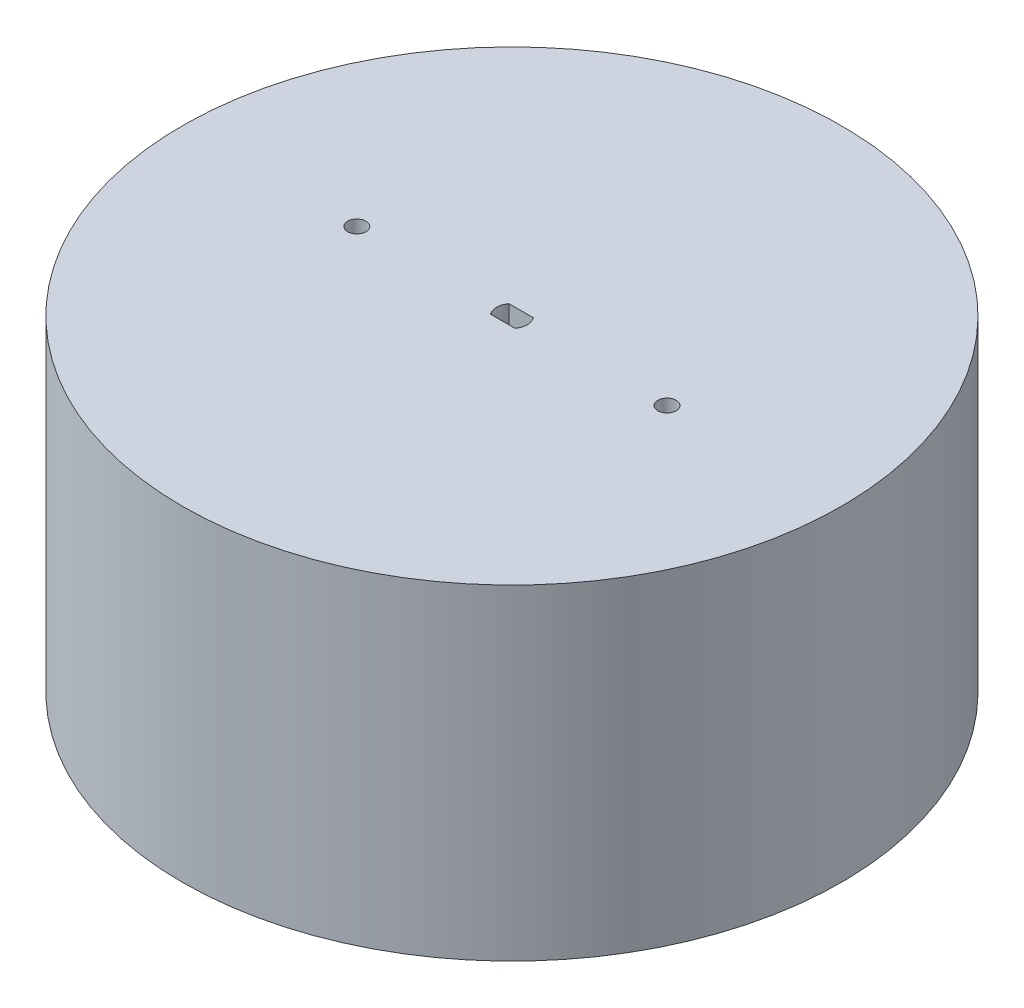
ISO-10303-21;
HEADER;
FILE_DESCRIPTION(('STEP AP214'),'2;1');
FILE_NAME('part.step','',(''),(''),'','','');
FILE_SCHEMA(('AUTOMOTIVE_DESIGN { 1 0 10303 214 1 1 1 1 }'));
ENDSEC;
DATA;
#1=APPLICATION_CONTEXT('core data for automotive mechanical design processes');
#2=APPLICATION_PROTOCOL_DEFINITION('international standard','automotive_design',2000,#1);
#3=PRODUCT_CONTEXT('',#1,'mechanical');
#4=PRODUCT('Part','Part','',(#3));
#5=PRODUCT_RELATED_PRODUCT_CATEGORY('part','',(#4));
#6=PRODUCT_DEFINITION_FORMATION('','',#4);
#7=PRODUCT_DEFINITION_CONTEXT('part definition',#1,'design');
#8=PRODUCT_DEFINITION('design','',#6,#7);
#9=PRODUCT_DEFINITION_SHAPE('','',#8);
#10=(LENGTH_UNIT() NAMED_UNIT(*) SI_UNIT(.MILLI.,.METRE.));
#11=(NAMED_UNIT(*) PLANE_ANGLE_UNIT() SI_UNIT($,.RADIAN.));
#12=(NAMED_UNIT(*) SI_UNIT($,.STERADIAN.) SOLID_ANGLE_UNIT());
#13=UNCERTAINTY_MEASURE_WITH_UNIT(LENGTH_MEASURE(1.E-05),#10,'distance_accuracy_value','');
#14=(GEOMETRIC_REPRESENTATION_CONTEXT(3) GLOBAL_UNCERTAINTY_ASSIGNED_CONTEXT((#13)) GLOBAL_UNIT_ASSIGNED_CONTEXT((#10,
#11,#12)) REPRESENTATION_CONTEXT('',''));
#15=CARTESIAN_POINT('',(0.,0.,0.));
#16=DIRECTION('',(0.,0.,1.));
#17=DIRECTION('',(1.,0.,0.));
#18=AXIS2_PLACEMENT_3D('',#15,#16,#17);
#19=CARTESIAN_POINT('',(0.,0.,0.));
#20=DIRECTION('',(0.,1.,0.));
#21=DIRECTION('',(0.,0.,1.));
#22=AXIS2_PLACEMENT_3D('',#19,#20,#21);
#23=PLANE('',#22);
#24=CARTESIAN_POINT('',(25.4,0.,0.));
#25=DIRECTION('',(0.,1.,0.));
#26=DIRECTION('',(0.,0.,1.));
#27=AXIS2_PLACEMENT_3D('',#24,#25,#26);
#28=CIRCLE('',#27,1.5);
#29=CARTESIAN_POINT('',(25.4,0.,1.5));
#30=VERTEX_POINT('',#29);
#31=EDGE_CURVE('E288',#30,#30,#28,.T.);
#32=ORIENTED_EDGE('',*,*,#31,.T.);
#33=EDGE_LOOP('',(#32));
#34=FACE_BOUND('',#33,.T.);
#35=CARTESIAN_POINT('',(-25.4,0.,0.));
#36=DIRECTION('',(0.,1.,0.));
#37=DIRECTION('',(0.,0.,1.));
#38=AXIS2_PLACEMENT_3D('',#35,#36,#37);
#39=CIRCLE('',#38,1.5);
#40=CARTESIAN_POINT('',(-25.4,0.,1.5));
#41=VERTEX_POINT('',#40);
#42=EDGE_CURVE('E294',#41,#41,#39,.T.);
#43=ORIENTED_EDGE('',*,*,#42,.T.);
#44=EDGE_LOOP('',(#43));
#45=FACE_BOUND('',#44,.T.);
#46=DIRECTION('',(-1.,0.,0.));
#47=VECTOR('',#46,1.);
#48=CARTESIAN_POINT('',(0.,0.,-1.5));
#49=LINE('',#48,#47);
#50=CARTESIAN_POINT('',(2.00000000000027,0.,-1.5));
#51=VERTEX_POINT('',#50);
#52=CARTESIAN_POINT('',(-1.99999999999974,0.,-1.5));
#53=VERTEX_POINT('',#52);
#54=EDGE_CURVE('E56',#51,#53,#49,.T.);
#55=ORIENTED_EDGE('',*,*,#54,.T.);
#56=CARTESIAN_POINT('',(4.70977423727703E-13,0.,0.));
#57=DIRECTION('',(0.,1.,0.));
#58=DIRECTION('',(0.,0.,1.));
#59=AXIS2_PLACEMENT_3D('',#56,#57,#58);
#60=CIRCLE('',#59,2.50000000000017);
#61=CARTESIAN_POINT('',(-1.99999999999974,0.,1.5));
#62=VERTEX_POINT('',#61);
#63=EDGE_CURVE('E11',#53,#62,#60,.T.);
#64=ORIENTED_EDGE('',*,*,#63,.T.);
#65=DIRECTION('',(1.,0.,0.));
#66=VECTOR('',#65,1.);
#67=CARTESIAN_POINT('',(0.,0.,1.5));
#68=LINE('',#67,#66);
#69=CARTESIAN_POINT('',(2.00000000000027,0.,1.5));
#70=VERTEX_POINT('',#69);
#71=EDGE_CURVE('E136',#62,#70,#68,.T.);
#72=ORIENTED_EDGE('',*,*,#71,.T.);
#73=CARTESIAN_POINT('',(0.,0.,0.));
#74=DIRECTION('',(0.,1.,0.));
#75=DIRECTION('',(0.,0.,1.));
#76=AXIS2_PLACEMENT_3D('',#73,#74,#75);
#77=CIRCLE('',#76,2.50000000000021);
#78=EDGE_CURVE('E95',#70,#51,#77,.T.);
#79=ORIENTED_EDGE('',*,*,#78,.T.);
#80=EDGE_LOOP('',(#55,#64,#72,#79));
#81=FACE_BOUND('',#80,.T.);
#82=CARTESIAN_POINT('',(0.,0.,0.));
#83=DIRECTION('',(0.,-1.,0.));
#84=DIRECTION('',(0.,0.,-1.));
#85=AXIS2_PLACEMENT_3D('',#82,#83,#84);
#86=CIRCLE('',#85,34.925);
#87=CARTESIAN_POINT('',(0.,0.,-34.925));
#88=VERTEX_POINT('',#87);
#89=EDGE_CURVE('E282',#88,#88,#86,.T.);
#90=ORIENTED_EDGE('',*,*,#89,.T.);
#91=EDGE_LOOP('',(#90));
#92=FACE_BOUND('',#91,.T.);
#93=ADVANCED_FACE('F47',(#34,#45,#81,#92),#23,.F.);
#94=CARTESIAN_POINT('',(0.,8.89,0.));
#95=DIRECTION('',(0.,-1.,0.));
#96=DIRECTION('',(0.,0.,-1.));
#97=AXIS2_PLACEMENT_3D('',#94,#95,#96);
#98=CYLINDRICAL_SURFACE('',#97,53.975);
#99=CARTESIAN_POINT('',(0.,8.89,0.));
#100=DIRECTION('',(0.,1.,0.));
#101=DIRECTION('',(0.,0.,1.));
#102=AXIS2_PLACEMENT_3D('',#99,#100,#101);
#103=CIRCLE('',#102,53.975);
#104=CARTESIAN_POINT('',(0.,8.89,53.975));
#105=VERTEX_POINT('',#104);
#106=EDGE_CURVE('E132',#105,#105,#103,.T.);
#107=ORIENTED_EDGE('',*,*,#106,.F.);
#108=EDGE_LOOP('',(#107));
#109=FACE_BOUND('',#108,.T.);
#110=CARTESIAN_POINT('',(0.,-44.45,0.));
#111=DIRECTION('',(0.,1.,0.));
#112=DIRECTION('',(0.,0.,1.));
#113=AXIS2_PLACEMENT_3D('',#110,#111,#112);
#114=CIRCLE('',#113,53.975);
#115=CARTESIAN_POINT('',(0.,-44.45,53.975));
#116=VERTEX_POINT('',#115);
#117=EDGE_CURVE('E128',#116,#116,#114,.T.);
#118=ORIENTED_EDGE('',*,*,#117,.T.);
#119=EDGE_LOOP('',(#118));
#120=FACE_BOUND('',#119,.T.);
#121=ADVANCED_FACE('F49',(#109,#120),#98,.T.);
#122=CARTESIAN_POINT('',(0.,8.89,0.));
#123=DIRECTION('',(0.,1.,0.));
#124=DIRECTION('',(0.,0.,1.));
#125=AXIS2_PLACEMENT_3D('',#122,#123,#124);
#126=PLANE('',#125);
#127=CARTESIAN_POINT('',(25.4,8.89,0.));
#128=DIRECTION('',(0.,1.,0.));
#129=DIRECTION('',(0.,0.,1.));
#130=AXIS2_PLACEMENT_3D('',#127,#128,#129);
#131=CIRCLE('',#130,1.5);
#132=CARTESIAN_POINT('',(25.4,8.89,1.5));
#133=VERTEX_POINT('',#132);
#134=EDGE_CURVE('E298',#133,#133,#131,.T.);
#135=ORIENTED_EDGE('',*,*,#134,.F.);
#136=EDGE_LOOP('',(#135));
#137=FACE_BOUND('',#136,.T.);
#138=CARTESIAN_POINT('',(-25.4,8.89,0.));
#139=DIRECTION('',(0.,1.,0.));
#140=DIRECTION('',(0.,0.,1.));
#141=AXIS2_PLACEMENT_3D('',#138,#139,#140);
#142=CIRCLE('',#141,1.5);
#143=CARTESIAN_POINT('',(-25.4,8.89,1.5));
#144=VERTEX_POINT('',#143);
#145=EDGE_CURVE('E299',#144,#144,#142,.T.);
#146=ORIENTED_EDGE('',*,*,#145,.F.);
#147=EDGE_LOOP('',(#146));
#148=FACE_BOUND('',#147,.T.);
#149=CARTESIAN_POINT('',(4.70977423727703E-13,8.89,0.));
#150=DIRECTION('',(0.,1.,0.));
#151=DIRECTION('',(0.,0.,1.));
#152=AXIS2_PLACEMENT_3D('',#149,#150,#151);
#153=CIRCLE('',#152,2.50000000000017);
#154=CARTESIAN_POINT('',(-1.99999999999974,8.89,-1.5));
#155=VERTEX_POINT('',#154);
#156=CARTESIAN_POINT('',(-1.99999999999974,8.89,1.5));
#157=VERTEX_POINT('',#156);
#158=EDGE_CURVE('E63',#155,#157,#153,.T.);
#159=ORIENTED_EDGE('',*,*,#158,.F.);
#160=DIRECTION('',(-1.,0.,0.));
#161=VECTOR('',#160,1.);
#162=CARTESIAN_POINT('',(-1.99999999999974,8.89,-1.5));
#163=LINE('',#162,#161);
#164=CARTESIAN_POINT('',(2.00000000000027,8.89,-1.5));
#165=VERTEX_POINT('',#164);
#166=EDGE_CURVE('E110',#165,#155,#163,.T.);
#167=ORIENTED_EDGE('',*,*,#166,.F.);
#168=CARTESIAN_POINT('',(0.,8.89,0.));
#169=DIRECTION('',(0.,1.,0.));
#170=DIRECTION('',(0.,0.,-1.));
#171=AXIS2_PLACEMENT_3D('',#168,#169,#170);
#172=CIRCLE('',#171,2.50000000000021);
#173=CARTESIAN_POINT('',(2.00000000000027,8.89,1.5));
#174=VERTEX_POINT('',#173);
#175=EDGE_CURVE('E92',#174,#165,#172,.T.);
#176=ORIENTED_EDGE('',*,*,#175,.F.);
#177=DIRECTION('',(1.,0.,0.));
#178=VECTOR('',#177,1.);
#179=CARTESIAN_POINT('',(-1.99999999999974,8.89,1.5));
#180=LINE('',#179,#178);
#181=EDGE_CURVE('E102',#157,#174,#180,.T.);
#182=ORIENTED_EDGE('',*,*,#181,.F.);
#183=EDGE_LOOP('',(#159,#167,#176,#182));
#184=FACE_BOUND('',#183,.T.);
#185=ORIENTED_EDGE('',*,*,#106,.T.);
#186=EDGE_LOOP('',(#185));
#187=FACE_BOUND('',#186,.T.);
#188=ADVANCED_FACE('F107',(#137,#148,#184,#187),#126,.T.);
#189=CARTESIAN_POINT('',(0.,-44.45,0.));
#190=DIRECTION('',(0.,1.,0.));
#191=DIRECTION('',(0.,0.,1.));
#192=AXIS2_PLACEMENT_3D('',#189,#190,#191);
#193=PLANE('',#192);
#194=CARTESIAN_POINT('',(0.,-44.45,0.));
#195=DIRECTION('',(0.,1.,0.));
#196=DIRECTION('',(0.,0.,1.));
#197=AXIS2_PLACEMENT_3D('',#194,#195,#196);
#198=CIRCLE('',#197,47.625);
#199=CARTESIAN_POINT('',(0.,-44.45,47.625));
#200=VERTEX_POINT('',#199);
#201=EDGE_CURVE('E120',#200,#200,#198,.T.);
#202=ORIENTED_EDGE('',*,*,#201,.T.);
#203=EDGE_LOOP('',(#202));
#204=FACE_BOUND('',#203,.T.);
#205=ORIENTED_EDGE('',*,*,#117,.F.);
#206=EDGE_LOOP('',(#205));
#207=FACE_BOUND('',#206,.T.);
#208=ADVANCED_FACE('F157',(#204,#207),#193,.F.);
#209=CARTESIAN_POINT('',(0.,-44.45,0.));
#210=DIRECTION('',(0.,1.,0.));
#211=DIRECTION('',(0.,0.,1.));
#212=AXIS2_PLACEMENT_3D('',#209,#210,#211);
#213=CYLINDRICAL_SURFACE('',#212,47.625);
#214=CARTESIAN_POINT('',(0.,-3.4925,0.));
#215=DIRECTION('',(0.,-1.,0.));
#216=DIRECTION('',(0.,0.,-1.));
#217=AXIS2_PLACEMENT_3D('',#214,#215,#216);
#218=CIRCLE('',#217,47.625);
#219=CARTESIAN_POINT('',(0.,-3.4925,-47.625));
#220=VERTEX_POINT('',#219);
#221=EDGE_CURVE('E277',#220,#220,#218,.T.);
#222=ORIENTED_EDGE('',*,*,#221,.F.);
#223=EDGE_LOOP('',(#222));
#224=FACE_BOUND('',#223,.T.);
#225=ORIENTED_EDGE('',*,*,#201,.F.);
#226=EDGE_LOOP('',(#225));
#227=FACE_BOUND('',#226,.T.);
#228=ADVANCED_FACE('F149',(#224,#227),#213,.F.);
#229=CARTESIAN_POINT('',(4.70977423727703E-13,-16.51,0.));
#230=DIRECTION('',(0.,1.,0.));
#231=DIRECTION('',(0.,0.,1.));
#232=AXIS2_PLACEMENT_3D('',#229,#230,#231);
#233=CYLINDRICAL_SURFACE('',#232,2.50000000000017);
#234=DIRECTION('',(0.,1.,0.));
#235=VECTOR('',#234,1.);
#236=CARTESIAN_POINT('',(-1.99999999999974,-16.51,-1.5));
#237=LINE('',#236,#235);
#238=EDGE_CURVE('E117',#53,#155,#237,.T.);
#239=ORIENTED_EDGE('',*,*,#238,.T.);
#240=ORIENTED_EDGE('',*,*,#158,.T.);
#241=DIRECTION('',(0.,1.,0.));
#242=VECTOR('',#241,1.);
#243=CARTESIAN_POINT('',(-1.99999999999974,-16.51,1.5));
#244=LINE('',#243,#242);
#245=EDGE_CURVE('E99',#62,#157,#244,.T.);
#246=ORIENTED_EDGE('',*,*,#245,.F.);
#247=ORIENTED_EDGE('',*,*,#63,.F.);
#248=EDGE_LOOP('',(#239,#240,#246,#247));
#249=FACE_BOUND('',#248,.T.);
#250=ADVANCED_FACE('F147',(#249),#233,.F.);
#251=CARTESIAN_POINT('',(-1.99999999999974,-16.51,-1.5));
#252=DIRECTION('',(0.,0.,-1.));
#253=DIRECTION('',(-1.,0.,0.));
#254=AXIS2_PLACEMENT_3D('',#251,#252,#253);
#255=PLANE('',#254);
#256=DIRECTION('',(0.,1.,0.));
#257=VECTOR('',#256,1.);
#258=CARTESIAN_POINT('',(2.00000000000027,-16.51,-1.5));
#259=LINE('',#258,#257);
#260=EDGE_CURVE('E98',#51,#165,#259,.T.);
#261=ORIENTED_EDGE('',*,*,#260,.T.);
#262=ORIENTED_EDGE('',*,*,#166,.T.);
#263=ORIENTED_EDGE('',*,*,#238,.F.);
#264=ORIENTED_EDGE('',*,*,#54,.F.);
#265=EDGE_LOOP('',(#261,#262,#263,#264));
#266=FACE_BOUND('',#265,.T.);
#267=ADVANCED_FACE('F146',(#266),#255,.F.);
#268=CARTESIAN_POINT('',(0.,-16.51,0.));
#269=DIRECTION('',(0.,1.,0.));
#270=DIRECTION('',(0.,0.,1.));
#271=AXIS2_PLACEMENT_3D('',#268,#269,#270);
#272=CYLINDRICAL_SURFACE('',#271,2.50000000000021);
#273=DIRECTION('',(0.,1.,0.));
#274=VECTOR('',#273,1.);
#275=CARTESIAN_POINT('',(2.00000000000027,-16.51,1.5));
#276=LINE('',#275,#274);
#277=EDGE_CURVE('E71',#70,#174,#276,.T.);
#278=ORIENTED_EDGE('',*,*,#277,.T.);
#279=ORIENTED_EDGE('',*,*,#175,.T.);
#280=ORIENTED_EDGE('',*,*,#260,.F.);
#281=ORIENTED_EDGE('',*,*,#78,.F.);
#282=EDGE_LOOP('',(#278,#279,#280,#281));
#283=FACE_BOUND('',#282,.T.);
#284=ADVANCED_FACE('F89',(#283),#272,.F.);
#285=CARTESIAN_POINT('',(-1.99999999999974,-16.51,1.5));
#286=DIRECTION('',(0.,0.,1.));
#287=DIRECTION('',(1.,0.,0.));
#288=AXIS2_PLACEMENT_3D('',#285,#286,#287);
#289=PLANE('',#288);
#290=ORIENTED_EDGE('',*,*,#245,.T.);
#291=ORIENTED_EDGE('',*,*,#181,.T.);
#292=ORIENTED_EDGE('',*,*,#277,.F.);
#293=ORIENTED_EDGE('',*,*,#71,.F.);
#294=EDGE_LOOP('',(#290,#291,#292,#293));
#295=FACE_BOUND('',#294,.T.);
#296=ADVANCED_FACE('F103',(#295),#289,.F.);
#297=CARTESIAN_POINT('',(0.,-3.4925,0.));
#298=DIRECTION('',(0.,-1.,0.));
#299=DIRECTION('',(0.,0.,-1.));
#300=AXIS2_PLACEMENT_3D('',#297,#298,#299);
#301=PLANE('',#300);
#302=ORIENTED_EDGE('',*,*,#221,.T.);
#303=EDGE_LOOP('',(#302));
#304=FACE_BOUND('',#303,.T.);
#305=CARTESIAN_POINT('',(0.,-3.4925,0.));
#306=DIRECTION('',(0.,-1.,0.));
#307=DIRECTION('',(0.,0.,-1.));
#308=AXIS2_PLACEMENT_3D('',#305,#306,#307);
#309=CIRCLE('',#308,34.925);
#310=CARTESIAN_POINT('',(0.,-3.4925,-34.925));
#311=VERTEX_POINT('',#310);
#312=EDGE_CURVE('E280',#311,#311,#309,.T.);
#313=ORIENTED_EDGE('',*,*,#312,.F.);
#314=EDGE_LOOP('',(#313));
#315=FACE_BOUND('',#314,.T.);
#316=ADVANCED_FACE('F225',(#304,#315),#301,.T.);
#317=CARTESIAN_POINT('',(0.,-3.4925,0.));
#318=DIRECTION('',(0.,1.,0.));
#319=DIRECTION('',(0.,0.,1.));
#320=AXIS2_PLACEMENT_3D('',#317,#318,#319);
#321=CYLINDRICAL_SURFACE('',#320,34.925);
#322=ORIENTED_EDGE('',*,*,#312,.T.);
#323=EDGE_LOOP('',(#322));
#324=FACE_BOUND('',#323,.T.);
#325=ORIENTED_EDGE('',*,*,#89,.F.);
#326=EDGE_LOOP('',(#325));
#327=FACE_BOUND('',#326,.T.);
#328=ADVANCED_FACE('F206',(#324,#327),#321,.F.);
#329=CARTESIAN_POINT('',(-25.4,-12.3825,0.));
#330=DIRECTION('',(0.,1.,0.));
#331=DIRECTION('',(0.,0.,1.));
#332=AXIS2_PLACEMENT_3D('',#329,#330,#331);
#333=CYLINDRICAL_SURFACE('',#332,1.5);
#334=CARTESIAN_POINT('',(-25.4,8.89,1.5));
#335=CARTESIAN_POINT('',(-25.4,8.79739583333333,1.5));
#336=CARTESIAN_POINT('',(-25.4,8.70479166666667,1.5));
#337=CARTESIAN_POINT('',(-25.4,8.51958333333333,1.5));
#338=CARTESIAN_POINT('',(-25.4,8.42697916666667,1.5));
#339=CARTESIAN_POINT('',(-25.4,8.24177083333333,1.5));
#340=CARTESIAN_POINT('',(-25.4,8.14916666666667,1.5));
#341=CARTESIAN_POINT('',(-25.4,7.96395833333333,1.5));
#342=CARTESIAN_POINT('',(-25.4,7.87135416666667,1.5));
#343=CARTESIAN_POINT('',(-25.4,7.68614583333333,1.5));
#344=CARTESIAN_POINT('',(-25.4,7.59354166666667,1.5));
#345=CARTESIAN_POINT('',(-25.4,7.40833333333333,1.5));
#346=CARTESIAN_POINT('',(-25.4,7.31572916666666,1.5));
#347=CARTESIAN_POINT('',(-25.4,7.13052083333333,1.5));
#348=CARTESIAN_POINT('',(-25.4,7.03791666666666,1.5));
#349=CARTESIAN_POINT('',(-25.4,6.85270833333333,1.5));
#350=CARTESIAN_POINT('',(-25.4,6.76010416666666,1.5));
#351=CARTESIAN_POINT('',(-25.4,6.57489583333333,1.5));
#352=CARTESIAN_POINT('',(-25.4,6.48229166666666,1.5));
#353=CARTESIAN_POINT('',(-25.4,6.29708333333333,1.5));
#354=CARTESIAN_POINT('',(-25.4,6.20447916666667,1.5));
#355=CARTESIAN_POINT('',(-25.4,6.01927083333333,1.5));
#356=CARTESIAN_POINT('',(-25.4,5.92666666666666,1.5));
#357=CARTESIAN_POINT('',(-25.4,5.74145833333333,1.5));
#358=CARTESIAN_POINT('',(-25.4,5.64885416666666,1.5));
#359=CARTESIAN_POINT('',(-25.4,5.46364583333333,1.5));
#360=CARTESIAN_POINT('',(-25.4,5.37104166666666,1.5));
#361=CARTESIAN_POINT('',(-25.4,5.18583333333333,1.5));
#362=CARTESIAN_POINT('',(-25.4,5.09322916666666,1.5));
#363=CARTESIAN_POINT('',(-25.4,4.90802083333333,1.5));
#364=CARTESIAN_POINT('',(-25.4,4.81541666666666,1.5));
#365=CARTESIAN_POINT('',(-25.4,4.63020833333333,1.5));
#366=CARTESIAN_POINT('',(-25.4,4.53760416666666,1.5));
#367=CARTESIAN_POINT('',(-25.4,4.35239583333333,1.5));
#368=CARTESIAN_POINT('',(-25.4,4.25979166666666,1.5));
#369=CARTESIAN_POINT('',(-25.4,4.07458333333333,1.5));
#370=CARTESIAN_POINT('',(-25.4,3.98197916666666,1.5));
#371=CARTESIAN_POINT('',(-25.4,3.79677083333333,1.5));
#372=CARTESIAN_POINT('',(-25.4,3.70416666666666,1.5));
#373=CARTESIAN_POINT('',(-25.4,3.51895833333333,1.5));
#374=CARTESIAN_POINT('',(-25.4,3.42635416666666,1.5));
#375=CARTESIAN_POINT('',(-25.4,3.24114583333333,1.5));
#376=CARTESIAN_POINT('',(-25.4,3.14854166666667,1.5));
#377=CARTESIAN_POINT('',(-25.4,2.96333333333333,1.5));
#378=CARTESIAN_POINT('',(-25.4,2.87072916666667,1.5));
#379=CARTESIAN_POINT('',(-25.4,2.68552083333333,1.5));
#380=CARTESIAN_POINT('',(-25.4,2.59291666666667,1.5));
#381=CARTESIAN_POINT('',(-25.4,2.40770833333333,1.5));
#382=CARTESIAN_POINT('',(-25.4,2.31510416666667,1.5));
#383=CARTESIAN_POINT('',(-25.4,2.12989583333333,1.5));
#384=CARTESIAN_POINT('',(-25.4,2.03729166666667,1.5));
#385=CARTESIAN_POINT('',(-25.4,1.85208333333333,1.5));
#386=CARTESIAN_POINT('',(-25.4,1.75947916666667,1.5));
#387=CARTESIAN_POINT('',(-25.4,1.57427083333333,1.5));
#388=CARTESIAN_POINT('',(-25.4,1.48166666666666,1.5));
#389=CARTESIAN_POINT('',(-25.4,1.29645833333333,1.5));
#390=CARTESIAN_POINT('',(-25.4,1.20385416666667,1.5));
#391=CARTESIAN_POINT('',(-25.4,1.01864583333333,1.5));
#392=CARTESIAN_POINT('',(-25.4,0.926041666666666,1.5));
#393=CARTESIAN_POINT('',(-25.4,0.740833333333332,1.5));
#394=CARTESIAN_POINT('',(-25.4,0.648229166666666,1.5));
#395=CARTESIAN_POINT('',(-25.4,0.463020833333332,1.5));
#396=CARTESIAN_POINT('',(-25.4,0.370416666666665,1.5));
#397=CARTESIAN_POINT('',(-25.4,0.185208333333332,1.5));
#398=CARTESIAN_POINT('',(-25.4,0.0926041666666652,1.5));
#399=CARTESIAN_POINT('',(-25.4,0.,1.5));
#400=B_SPLINE_CURVE_WITH_KNOTS('',3,(#334,#335,#336,#337,#338,#339,#340,#341,#342,#343,#344,
#345,#346,#347,#348,#349,#350,#351,#352,#353,#354,#355,#356,#357,#358,#359,#360,#361,#362,#363,
#364,#365,#366,#367,#368,#369,#370,#371,#372,#373,#374,#375,#376,#377,#378,#379,#380,#381,#382,
#383,#384,#385,#386,#387,#388,#389,#390,#391,#392,#393,#394,#395,#396,#397,#398,#399),
.UNSPECIFIED.,.F.,.F.,(4,2,2,2,2,2,2,2,2,2,2,2,2,2,2,2,2,2,2,2,2,2,2,2,2,2,2,2,2,2,2,2,4),(0.,
0.277812499999999,0.555625000000001,0.833437499999999,1.11125,1.3890625,1.666875,1.9446875,
2.2225,2.5003125,2.778125,3.0559375,3.33375,3.6115625,3.889375,4.1671875,4.445,4.7228125,
5.000625,5.2784375,5.55625,5.8340625,6.111875,6.3896875,6.6675,6.9453125,7.223125,7.5009375,
7.77875,8.0565625,8.334375,8.6121875,8.89),.UNSPECIFIED.);
#401=EDGE_CURVE('BSEAM201',#144,#41,#400,.T.);
#402=ORIENTED_EDGE('',*,*,#145,.T.);
#403=ORIENTED_EDGE('',*,*,#42,.F.);
#404=ORIENTED_EDGE('',*,*,#401,.T.);
#405=ORIENTED_EDGE('',*,*,#401,.F.);
#406=EDGE_LOOP('',(#402,#404,#403,#405));
#407=FACE_BOUND('',#406,.T.);
#408=ADVANCED_FACE('F201',(#407),#333,.F.);
#409=CARTESIAN_POINT('',(25.4,-12.3825,0.));
#410=DIRECTION('',(0.,1.,0.));
#411=DIRECTION('',(0.,0.,1.));
#412=AXIS2_PLACEMENT_3D('',#409,#410,#411);
#413=CYLINDRICAL_SURFACE('',#412,1.5);
#414=CARTESIAN_POINT('',(25.4,8.89,1.5));
#415=CARTESIAN_POINT('',(25.4,8.79739583333333,1.5));
#416=CARTESIAN_POINT('',(25.4,8.70479166666667,1.5));
#417=CARTESIAN_POINT('',(25.4,8.51958333333333,1.5));
#418=CARTESIAN_POINT('',(25.4,8.42697916666667,1.5));
#419=CARTESIAN_POINT('',(25.4,8.24177083333333,1.5));
#420=CARTESIAN_POINT('',(25.4,8.14916666666667,1.5));
#421=CARTESIAN_POINT('',(25.4,7.96395833333333,1.5));
#422=CARTESIAN_POINT('',(25.4,7.87135416666667,1.5));
#423=CARTESIAN_POINT('',(25.4,7.68614583333333,1.5));
#424=CARTESIAN_POINT('',(25.4,7.59354166666667,1.5));
#425=CARTESIAN_POINT('',(25.4,7.40833333333333,1.5));
#426=CARTESIAN_POINT('',(25.4,7.31572916666666,1.5));
#427=CARTESIAN_POINT('',(25.4,7.13052083333333,1.5));
#428=CARTESIAN_POINT('',(25.4,7.03791666666666,1.5));
#429=CARTESIAN_POINT('',(25.4,6.85270833333333,1.5));
#430=CARTESIAN_POINT('',(25.4,6.76010416666666,1.5));
#431=CARTESIAN_POINT('',(25.4,6.57489583333333,1.5));
#432=CARTESIAN_POINT('',(25.4,6.48229166666666,1.5));
#433=CARTESIAN_POINT('',(25.4,6.29708333333333,1.5));
#434=CARTESIAN_POINT('',(25.4,6.20447916666667,1.5));
#435=CARTESIAN_POINT('',(25.4,6.01927083333333,1.5));
#436=CARTESIAN_POINT('',(25.4,5.92666666666666,1.5));
#437=CARTESIAN_POINT('',(25.4,5.74145833333333,1.5));
#438=CARTESIAN_POINT('',(25.4,5.64885416666666,1.5));
#439=CARTESIAN_POINT('',(25.4,5.46364583333333,1.5));
#440=CARTESIAN_POINT('',(25.4,5.37104166666666,1.5));
#441=CARTESIAN_POINT('',(25.4,5.18583333333333,1.5));
#442=CARTESIAN_POINT('',(25.4,5.09322916666666,1.5));
#443=CARTESIAN_POINT('',(25.4,4.90802083333333,1.5));
#444=CARTESIAN_POINT('',(25.4,4.81541666666666,1.5));
#445=CARTESIAN_POINT('',(25.4,4.63020833333333,1.5));
#446=CARTESIAN_POINT('',(25.4,4.53760416666666,1.5));
#447=CARTESIAN_POINT('',(25.4,4.35239583333333,1.5));
#448=CARTESIAN_POINT('',(25.4,4.25979166666666,1.5));
#449=CARTESIAN_POINT('',(25.4,4.07458333333333,1.5));
#450=CARTESIAN_POINT('',(25.4,3.98197916666666,1.5));
#451=CARTESIAN_POINT('',(25.4,3.79677083333333,1.5));
#452=CARTESIAN_POINT('',(25.4,3.70416666666666,1.5));
#453=CARTESIAN_POINT('',(25.4,3.51895833333333,1.5));
#454=CARTESIAN_POINT('',(25.4,3.42635416666666,1.5));
#455=CARTESIAN_POINT('',(25.4,3.24114583333333,1.5));
#456=CARTESIAN_POINT('',(25.4,3.14854166666667,1.5));
#457=CARTESIAN_POINT('',(25.4,2.96333333333333,1.5));
#458=CARTESIAN_POINT('',(25.4,2.87072916666667,1.5));
#459=CARTESIAN_POINT('',(25.4,2.68552083333333,1.5));
#460=CARTESIAN_POINT('',(25.4,2.59291666666667,1.5));
#461=CARTESIAN_POINT('',(25.4,2.40770833333333,1.5));
#462=CARTESIAN_POINT('',(25.4,2.31510416666667,1.5));
#463=CARTESIAN_POINT('',(25.4,2.12989583333333,1.5));
#464=CARTESIAN_POINT('',(25.4,2.03729166666667,1.5));
#465=CARTESIAN_POINT('',(25.4,1.85208333333333,1.5));
#466=CARTESIAN_POINT('',(25.4,1.75947916666667,1.5));
#467=CARTESIAN_POINT('',(25.4,1.57427083333333,1.5));
#468=CARTESIAN_POINT('',(25.4,1.48166666666666,1.5));
#469=CARTESIAN_POINT('',(25.4,1.29645833333333,1.5));
#470=CARTESIAN_POINT('',(25.4,1.20385416666667,1.5));
#471=CARTESIAN_POINT('',(25.4,1.01864583333333,1.5));
#472=CARTESIAN_POINT('',(25.4,0.926041666666666,1.5));
#473=CARTESIAN_POINT('',(25.4,0.740833333333332,1.5));
#474=CARTESIAN_POINT('',(25.4,0.648229166666666,1.5));
#475=CARTESIAN_POINT('',(25.4,0.463020833333332,1.5));
#476=CARTESIAN_POINT('',(25.4,0.370416666666665,1.5));
#477=CARTESIAN_POINT('',(25.4,0.185208333333332,1.5));
#478=CARTESIAN_POINT('',(25.4,0.0926041666666652,1.5));
#479=CARTESIAN_POINT('',(25.4,0.,1.5));
#480=B_SPLINE_CURVE_WITH_KNOTS('',3,(#414,#415,#416,#417,#418,#419,#420,#421,#422,#423,#424,
#425,#426,#427,#428,#429,#430,#431,#432,#433,#434,#435,#436,#437,#438,#439,#440,#441,#442,#443,
#444,#445,#446,#447,#448,#449,#450,#451,#452,#453,#454,#455,#456,#457,#458,#459,#460,#461,#462,
#463,#464,#465,#466,#467,#468,#469,#470,#471,#472,#473,#474,#475,#476,#477,#478,#479),
.UNSPECIFIED.,.F.,.F.,(4,2,2,2,2,2,2,2,2,2,2,2,2,2,2,2,2,2,2,2,2,2,2,2,2,2,2,2,2,2,2,2,4),(0.,
0.277812499999999,0.555625000000001,0.833437499999999,1.11125,1.3890625,1.666875,1.9446875,
2.2225,2.5003125,2.778125,3.0559375,3.33375,3.6115625,3.889375,4.1671875,4.445,4.7228125,
5.000625,5.2784375,5.55625,5.8340625,6.111875,6.3896875,6.6675,6.9453125,7.223125,7.5009375,
7.77875,8.0565625,8.334375,8.6121875,8.89),.UNSPECIFIED.);
#481=EDGE_CURVE('BSEAM205',#133,#30,#480,.T.);
#482=ORIENTED_EDGE('',*,*,#134,.T.);
#483=ORIENTED_EDGE('',*,*,#31,.F.);
#484=ORIENTED_EDGE('',*,*,#481,.T.);
#485=ORIENTED_EDGE('',*,*,#481,.F.);
#486=EDGE_LOOP('',(#482,#484,#483,#485));
#487=FACE_BOUND('',#486,.T.);
#488=ADVANCED_FACE('F205',(#487),#413,.F.);
#489=CLOSED_SHELL('',(#93,#121,#188,#208,#228,#250,#267,#284,#296,#316,#328,#408,#488));
#490=MANIFOLD_SOLID_BREP('B2',#489);
#491=ADVANCED_BREP_SHAPE_REPRESENTATION('',(#18,#490),#14);
#492=SHAPE_DEFINITION_REPRESENTATION(#9,#491);
ENDSEC;
END-ISO-10303-21;
